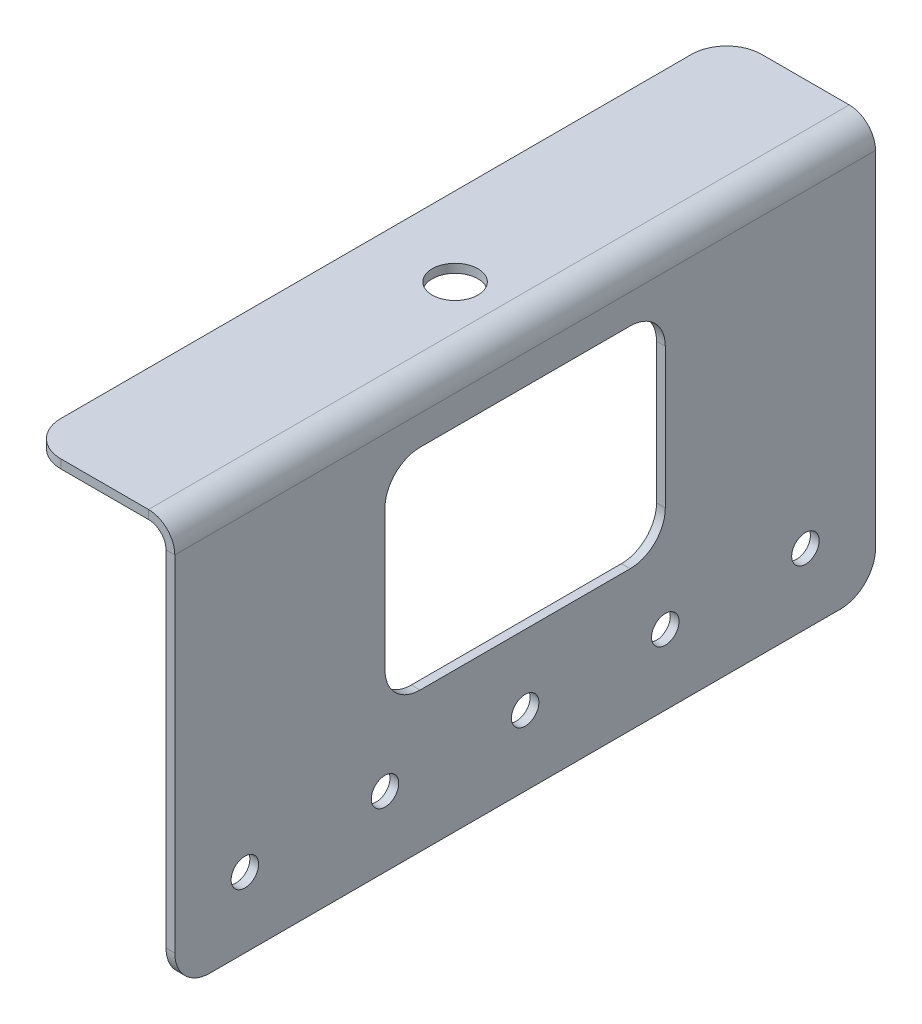
ISO-10303-21;
HEADER;
FILE_DESCRIPTION(('STEP AP214'),'2;1');
FILE_NAME('part.step','',(''),(''),'','','');
FILE_SCHEMA(('AUTOMOTIVE_DESIGN { 1 0 10303 214 1 1 1 1 }'));
ENDSEC;
DATA;
#1=APPLICATION_CONTEXT('core data for automotive mechanical design processes');
#2=APPLICATION_PROTOCOL_DEFINITION('international standard','automotive_design',2000,#1);
#3=PRODUCT_CONTEXT('',#1,'mechanical');
#4=PRODUCT('Part','Part','',(#3));
#5=PRODUCT_RELATED_PRODUCT_CATEGORY('part','',(#4));
#6=PRODUCT_DEFINITION_FORMATION('','',#4);
#7=PRODUCT_DEFINITION_CONTEXT('part definition',#1,'design');
#8=PRODUCT_DEFINITION('design','',#6,#7);
#9=PRODUCT_DEFINITION_SHAPE('','',#8);
#10=(LENGTH_UNIT() NAMED_UNIT(*) SI_UNIT(.MILLI.,.METRE.));
#11=(NAMED_UNIT(*) PLANE_ANGLE_UNIT() SI_UNIT($,.RADIAN.));
#12=(NAMED_UNIT(*) SI_UNIT($,.STERADIAN.) SOLID_ANGLE_UNIT());
#13=UNCERTAINTY_MEASURE_WITH_UNIT(LENGTH_MEASURE(1.E-05),#10,'distance_accuracy_value','');
#14=(GEOMETRIC_REPRESENTATION_CONTEXT(3) GLOBAL_UNCERTAINTY_ASSIGNED_CONTEXT((#13)) GLOBAL_UNIT_ASSIGNED_CONTEXT((#10,
#11,#12)) REPRESENTATION_CONTEXT('',''));
#15=CARTESIAN_POINT('',(0.,0.,0.));
#16=DIRECTION('',(0.,0.,1.));
#17=DIRECTION('',(1.,0.,0.));
#18=AXIS2_PLACEMENT_3D('',#15,#16,#17);
#19=CARTESIAN_POINT('',(39.6875,576.261738,-38.1));
#20=DIRECTION('',(0.,1.,0.));
#21=DIRECTION('',(0.,0.,1.));
#22=AXIS2_PLACEMENT_3D('',#19,#20,#21);
#23=PLANE('',#22);
#24=DIRECTION('',(1.,0.,0.));
#25=VECTOR('',#24,1.);
#26=CARTESIAN_POINT('',(39.6875,576.261738,-44.45));
#27=LINE('',#26,#25);
#28=CARTESIAN_POINT('',(38.1000000000001,576.261738,-44.45));
#29=VERTEX_POINT('',#28);
#30=CARTESIAN_POINT('',(39.6875,576.261738,-44.45));
#31=VERTEX_POINT('',#30);
#32=EDGE_CURVE('E11',#29,#31,#27,.T.);
#33=ORIENTED_EDGE('',*,*,#32,.F.);
#34=DIRECTION('',(0.,0.,1.));
#35=VECTOR('',#34,1.);
#36=CARTESIAN_POINT('',(38.1000000000001,576.261738,-127.));
#37=LINE('',#36,#35);
#38=CARTESIAN_POINT('',(38.1000000000001,576.261738,-82.55));
#39=VERTEX_POINT('',#38);
#40=EDGE_CURVE('E149',#39,#29,#37,.T.);
#41=ORIENTED_EDGE('',*,*,#40,.F.);
#42=DIRECTION('',(1.,0.,0.));
#43=VECTOR('',#42,1.);
#44=CARTESIAN_POINT('',(39.6875,576.261738,-82.55));
#45=LINE('',#44,#43);
#46=CARTESIAN_POINT('',(39.6875,576.261738,-82.55));
#47=VERTEX_POINT('',#46);
#48=EDGE_CURVE('E51',#39,#47,#45,.T.);
#49=ORIENTED_EDGE('',*,*,#48,.T.);
#50=DIRECTION('',(0.,0.,1.));
#51=VECTOR('',#50,1.);
#52=CARTESIAN_POINT('',(39.6875,576.261738,-38.1));
#53=LINE('',#52,#51);
#54=EDGE_CURVE('E229',#47,#31,#53,.T.);
#55=ORIENTED_EDGE('',*,*,#54,.T.);
#56=EDGE_LOOP('',(#33,#41,#49,#55));
#57=FACE_BOUND('',#56,.T.);
#58=ADVANCED_FACE('F41',(#57),#23,.F.);
#59=CARTESIAN_POINT('',(39.6875000000001,569.911738,-82.55));
#60=DIRECTION('',(1.,0.,0.));
#61=DIRECTION('',(0.,1.,0.));
#62=AXIS2_PLACEMENT_3D('',#59,#60,#61);
#63=CYLINDRICAL_SURFACE('',#62,6.35);
#64=ORIENTED_EDGE('',*,*,#48,.F.);
#65=CARTESIAN_POINT('',(38.1000000000001,569.911738,-82.55));
#66=DIRECTION('',(1.,0.,0.));
#67=DIRECTION('',(0.,1.,0.));
#68=AXIS2_PLACEMENT_3D('',#65,#66,#67);
#69=CIRCLE('',#68,6.35);
#70=CARTESIAN_POINT('',(38.1000000000001,569.911738,-88.9));
#71=VERTEX_POINT('',#70);
#72=EDGE_CURVE('E172',#39,#71,#69,.F.);
#73=ORIENTED_EDGE('',*,*,#72,.T.);
#74=DIRECTION('',(1.,0.,0.));
#75=VECTOR('',#74,1.);
#76=CARTESIAN_POINT('',(39.6875,569.911738,-88.9));
#77=LINE('',#76,#75);
#78=CARTESIAN_POINT('',(39.6875,569.911738,-88.9));
#79=VERTEX_POINT('',#78);
#80=EDGE_CURVE('E222',#71,#79,#77,.T.);
#81=ORIENTED_EDGE('',*,*,#80,.T.);
#82=CARTESIAN_POINT('',(39.6875000000001,569.911738,-82.55));
#83=DIRECTION('',(1.,0.,0.));
#84=DIRECTION('',(0.,1.,0.));
#85=AXIS2_PLACEMENT_3D('',#82,#83,#84);
#86=CIRCLE('',#85,6.35);
#87=EDGE_CURVE('E239',#47,#79,#86,.F.);
#88=ORIENTED_EDGE('',*,*,#87,.F.);
#89=EDGE_LOOP('',(#64,#73,#81,#88));
#90=FACE_BOUND('',#89,.T.);
#91=ADVANCED_FACE('F242',(#90),#63,.F.);
#92=CARTESIAN_POINT('',(39.6875,576.261738,-88.9));
#93=DIRECTION('',(0.,0.,-1.));
#94=DIRECTION('',(0.,1.,0.));
#95=AXIS2_PLACEMENT_3D('',#92,#93,#94);
#96=PLANE('',#95);
#97=ORIENTED_EDGE('',*,*,#80,.F.);
#98=DIRECTION('',(0.,1.,0.));
#99=VECTOR('',#98,1.);
#100=CARTESIAN_POINT('',(38.1000000000001,581.589048146248,-88.9));
#101=LINE('',#100,#99);
#102=CARTESIAN_POINT('',(38.1000000000001,544.511738,-88.9));
#103=VERTEX_POINT('',#102);
#104=EDGE_CURVE('E169',#103,#71,#101,.T.);
#105=ORIENTED_EDGE('',*,*,#104,.F.);
#106=DIRECTION('',(1.,0.,0.));
#107=VECTOR('',#106,1.);
#108=CARTESIAN_POINT('',(39.6875,544.511738,-88.9));
#109=LINE('',#108,#107);
#110=CARTESIAN_POINT('',(39.6875,544.511738,-88.9));
#111=VERTEX_POINT('',#110);
#112=EDGE_CURVE('E219',#103,#111,#109,.T.);
#113=ORIENTED_EDGE('',*,*,#112,.T.);
#114=DIRECTION('',(0.,1.,0.));
#115=VECTOR('',#114,1.);
#116=CARTESIAN_POINT('',(39.6875,576.261738,-88.9));
#117=LINE('',#116,#115);
#118=EDGE_CURVE('E243',#111,#79,#117,.T.);
#119=ORIENTED_EDGE('',*,*,#118,.T.);
#120=EDGE_LOOP('',(#97,#105,#113,#119));
#121=FACE_BOUND('',#120,.T.);
#122=ADVANCED_FACE('F380',(#121),#96,.F.);
#123=CARTESIAN_POINT('',(39.6875000000001,544.511738,-82.55));
#124=DIRECTION('',(1.,0.,0.));
#125=DIRECTION('',(0.,1.,0.));
#126=AXIS2_PLACEMENT_3D('',#123,#124,#125);
#127=CYLINDRICAL_SURFACE('',#126,6.35);
#128=ORIENTED_EDGE('',*,*,#112,.F.);
#129=CARTESIAN_POINT('',(38.1000000000001,544.511738,-82.55));
#130=DIRECTION('',(1.,0.,0.));
#131=DIRECTION('',(0.,1.,0.));
#132=AXIS2_PLACEMENT_3D('',#129,#130,#131);
#133=CIRCLE('',#132,6.35);
#134=CARTESIAN_POINT('',(38.1000000000001,538.161738,-82.55));
#135=VERTEX_POINT('',#134);
#136=EDGE_CURVE('E166',#103,#135,#133,.F.);
#137=ORIENTED_EDGE('',*,*,#136,.T.);
#138=DIRECTION('',(1.,0.,0.));
#139=VECTOR('',#138,1.);
#140=CARTESIAN_POINT('',(39.6875,538.161738,-82.55));
#141=LINE('',#140,#139);
#142=CARTESIAN_POINT('',(39.6875,538.161738,-82.55));
#143=VERTEX_POINT('',#142);
#144=EDGE_CURVE('E216',#135,#143,#141,.T.);
#145=ORIENTED_EDGE('',*,*,#144,.T.);
#146=CARTESIAN_POINT('',(39.6875000000001,544.511738,-82.55));
#147=DIRECTION('',(1.,0.,0.));
#148=DIRECTION('',(0.,1.,0.));
#149=AXIS2_PLACEMENT_3D('',#146,#147,#148);
#150=CIRCLE('',#149,6.35);
#151=EDGE_CURVE('E245',#111,#143,#150,.F.);
#152=ORIENTED_EDGE('',*,*,#151,.F.);
#153=EDGE_LOOP('',(#128,#137,#145,#152));
#154=FACE_BOUND('',#153,.T.);
#155=ADVANCED_FACE('F527',(#154),#127,.F.);
#156=CARTESIAN_POINT('',(39.6875,538.161738,-38.1));
#157=DIRECTION('',(0.,-1.,0.));
#158=DIRECTION('',(0.,0.,-1.));
#159=AXIS2_PLACEMENT_3D('',#156,#157,#158);
#160=PLANE('',#159);
#161=ORIENTED_EDGE('',*,*,#144,.F.);
#162=DIRECTION('',(0.,0.,1.));
#163=VECTOR('',#162,1.);
#164=CARTESIAN_POINT('',(38.1000000000001,538.161738,-127.));
#165=LINE('',#164,#163);
#166=CARTESIAN_POINT('',(38.1000000000001,538.161738,-44.45));
#167=VERTEX_POINT('',#166);
#168=EDGE_CURVE('E163',#167,#135,#165,.F.);
#169=ORIENTED_EDGE('',*,*,#168,.F.);
#170=DIRECTION('',(1.,0.,0.));
#171=VECTOR('',#170,1.);
#172=CARTESIAN_POINT('',(39.6875,538.161738,-44.45));
#173=LINE('',#172,#171);
#174=CARTESIAN_POINT('',(39.6875,538.161738,-44.45));
#175=VERTEX_POINT('',#174);
#176=EDGE_CURVE('E213',#167,#175,#173,.T.);
#177=ORIENTED_EDGE('',*,*,#176,.T.);
#178=DIRECTION('',(0.,0.,-1.));
#179=VECTOR('',#178,1.);
#180=CARTESIAN_POINT('',(39.6875,538.161738,-38.1));
#181=LINE('',#180,#179);
#182=EDGE_CURVE('E251',#175,#143,#181,.T.);
#183=ORIENTED_EDGE('',*,*,#182,.T.);
#184=EDGE_LOOP('',(#161,#169,#177,#183));
#185=FACE_BOUND('',#184,.T.);
#186=ADVANCED_FACE('F528',(#185),#160,.F.);
#187=CARTESIAN_POINT('',(39.6875000000001,544.511738,-44.45));
#188=DIRECTION('',(1.,0.,0.));
#189=DIRECTION('',(0.,1.,0.));
#190=AXIS2_PLACEMENT_3D('',#187,#188,#189);
#191=CYLINDRICAL_SURFACE('',#190,6.35);
#192=ORIENTED_EDGE('',*,*,#176,.F.);
#193=CARTESIAN_POINT('',(38.1000000000001,544.511738,-44.45));
#194=DIRECTION('',(1.,0.,0.));
#195=DIRECTION('',(0.,1.,0.));
#196=AXIS2_PLACEMENT_3D('',#193,#194,#195);
#197=CIRCLE('',#196,6.35);
#198=CARTESIAN_POINT('',(38.1000000000001,544.511738,-38.1));
#199=VERTEX_POINT('',#198);
#200=EDGE_CURVE('E160',#167,#199,#197,.F.);
#201=ORIENTED_EDGE('',*,*,#200,.T.);
#202=DIRECTION('',(1.,0.,0.));
#203=VECTOR('',#202,1.);
#204=CARTESIAN_POINT('',(39.6875,544.511738,-38.1));
#205=LINE('',#204,#203);
#206=CARTESIAN_POINT('',(39.6875,544.511738,-38.1));
#207=VERTEX_POINT('',#206);
#208=EDGE_CURVE('E139',#199,#207,#205,.T.);
#209=ORIENTED_EDGE('',*,*,#208,.T.);
#210=CARTESIAN_POINT('',(39.6875000000001,544.511738,-44.45));
#211=DIRECTION('',(1.,0.,0.));
#212=DIRECTION('',(0.,1.,0.));
#213=AXIS2_PLACEMENT_3D('',#210,#211,#212);
#214=CIRCLE('',#213,6.35);
#215=EDGE_CURVE('E254',#175,#207,#214,.F.);
#216=ORIENTED_EDGE('',*,*,#215,.F.);
#217=EDGE_LOOP('',(#192,#201,#209,#216));
#218=FACE_BOUND('',#217,.T.);
#219=ADVANCED_FACE('F511',(#218),#191,.F.);
#220=CARTESIAN_POINT('',(39.6875,576.261738,-38.1));
#221=DIRECTION('',(0.,0.,1.));
#222=DIRECTION('',(0.,-1.,0.));
#223=AXIS2_PLACEMENT_3D('',#220,#221,#222);
#224=PLANE('',#223);
#225=ORIENTED_EDGE('',*,*,#208,.F.);
#226=DIRECTION('',(0.,1.,0.));
#227=VECTOR('',#226,1.);
#228=CARTESIAN_POINT('',(38.1000000000001,581.589048146248,-38.1));
#229=LINE('',#228,#227);
#230=CARTESIAN_POINT('',(38.1000000000001,569.911738,-38.1));
#231=VERTEX_POINT('',#230);
#232=EDGE_CURVE('E146',#231,#199,#229,.F.);
#233=ORIENTED_EDGE('',*,*,#232,.F.);
#234=DIRECTION('',(1.,0.,0.));
#235=VECTOR('',#234,1.);
#236=CARTESIAN_POINT('',(39.6875,569.911738,-38.1));
#237=LINE('',#236,#235);
#238=CARTESIAN_POINT('',(39.6875,569.911738,-38.1));
#239=VERTEX_POINT('',#238);
#240=EDGE_CURVE('E45',#231,#239,#237,.T.);
#241=ORIENTED_EDGE('',*,*,#240,.T.);
#242=DIRECTION('',(0.,-1.,0.));
#243=VECTOR('',#242,1.);
#244=CARTESIAN_POINT('',(39.6875,576.261738,-38.1));
#245=LINE('',#244,#243);
#246=EDGE_CURVE('E505',#239,#207,#245,.T.);
#247=ORIENTED_EDGE('',*,*,#246,.T.);
#248=EDGE_LOOP('',(#225,#233,#241,#247));
#249=FACE_BOUND('',#248,.T.);
#250=ADVANCED_FACE('F151',(#249),#224,.F.);
#251=CARTESIAN_POINT('',(39.6875,519.111738,-6.35));
#252=DIRECTION('',(1.,0.,0.));
#253=DIRECTION('',(0.,1.,0.));
#254=AXIS2_PLACEMENT_3D('',#251,#252,#253);
#255=CYLINDRICAL_SURFACE('',#254,6.35);
#256=DIRECTION('',(1.,0.,0.));
#257=VECTOR('',#256,1.);
#258=CARTESIAN_POINT('',(39.6875,519.111738,0.));
#259=LINE('',#258,#257);
#260=CARTESIAN_POINT('',(38.1000000000001,519.111738,0.));
#261=VERTEX_POINT('',#260);
#262=CARTESIAN_POINT('',(39.6875,519.111738,0.));
#263=VERTEX_POINT('',#262);
#264=EDGE_CURVE('E140',#261,#263,#259,.T.);
#265=ORIENTED_EDGE('',*,*,#264,.F.);
#266=CARTESIAN_POINT('',(38.1000000000001,519.111738,-6.35));
#267=DIRECTION('',(1.,0.,0.));
#268=DIRECTION('',(0.,1.,0.));
#269=AXIS2_PLACEMENT_3D('',#266,#267,#268);
#270=CIRCLE('',#269,6.35);
#271=CARTESIAN_POINT('',(38.1,512.761738,-6.34999999999999));
#272=VERTEX_POINT('',#271);
#273=EDGE_CURVE('E341',#261,#272,#270,.T.);
#274=ORIENTED_EDGE('',*,*,#273,.T.);
#275=DIRECTION('',(1.,0.,0.));
#276=VECTOR('',#275,1.);
#277=CARTESIAN_POINT('',(39.6875,512.761738,-6.34999999999999));
#278=LINE('',#277,#276);
#279=CARTESIAN_POINT('',(39.6875,512.761738,-6.34999999999999));
#280=VERTEX_POINT('',#279);
#281=EDGE_CURVE('E204',#272,#280,#278,.T.);
#282=ORIENTED_EDGE('',*,*,#281,.T.);
#283=CARTESIAN_POINT('',(39.6875,519.111738,-6.35));
#284=DIRECTION('',(1.,0.,0.));
#285=DIRECTION('',(0.,1.,0.));
#286=AXIS2_PLACEMENT_3D('',#283,#284,#285);
#287=CIRCLE('',#286,6.35);
#288=EDGE_CURVE('E275',#263,#280,#287,.T.);
#289=ORIENTED_EDGE('',*,*,#288,.F.);
#290=EDGE_LOOP('',(#265,#274,#282,#289));
#291=FACE_BOUND('',#290,.T.);
#292=ADVANCED_FACE('F410',(#291),#255,.T.);
#293=CARTESIAN_POINT('',(39.6875,512.761738,-127.));
#294=DIRECTION('',(0.,1.,0.));
#295=DIRECTION('',(0.,0.,1.));
#296=AXIS2_PLACEMENT_3D('',#293,#294,#295);
#297=PLANE('',#296);
#298=ORIENTED_EDGE('',*,*,#281,.F.);
#299=DIRECTION('',(0.,0.,1.));
#300=VECTOR('',#299,1.);
#301=CARTESIAN_POINT('',(38.1,512.761738,-127.));
#302=LINE('',#301,#300);
#303=CARTESIAN_POINT('',(38.1,512.761738,-120.65));
#304=VERTEX_POINT('',#303);
#305=EDGE_CURVE('E178',#304,#272,#302,.T.);
#306=ORIENTED_EDGE('',*,*,#305,.F.);
#307=DIRECTION('',(1.,0.,0.));
#308=VECTOR('',#307,1.);
#309=CARTESIAN_POINT('',(39.6875,512.761738,-120.65));
#310=LINE('',#309,#308);
#311=CARTESIAN_POINT('',(39.6875,512.761738,-120.65));
#312=VERTEX_POINT('',#311);
#313=EDGE_CURVE('E201',#304,#312,#310,.T.);
#314=ORIENTED_EDGE('',*,*,#313,.T.);
#315=DIRECTION('',(0.,0.,1.));
#316=VECTOR('',#315,1.);
#317=CARTESIAN_POINT('',(39.6875,512.761738,-127.));
#318=LINE('',#317,#316);
#319=EDGE_CURVE('E260',#312,#280,#318,.T.);
#320=ORIENTED_EDGE('',*,*,#319,.T.);
#321=EDGE_LOOP('',(#298,#306,#314,#320));
#322=FACE_BOUND('',#321,.T.);
#323=ADVANCED_FACE('F468',(#322),#297,.F.);
#324=CARTESIAN_POINT('',(39.6875,519.111738,-120.65));
#325=DIRECTION('',(1.,0.,0.));
#326=DIRECTION('',(0.,1.,0.));
#327=AXIS2_PLACEMENT_3D('',#324,#325,#326);
#328=CYLINDRICAL_SURFACE('',#327,6.35);
#329=ORIENTED_EDGE('',*,*,#313,.F.);
#330=CARTESIAN_POINT('',(38.1000000000001,519.111738,-120.65));
#331=DIRECTION('',(1.,0.,0.));
#332=DIRECTION('',(0.,1.,0.));
#333=AXIS2_PLACEMENT_3D('',#330,#331,#332);
#334=CIRCLE('',#333,6.35);
#335=CARTESIAN_POINT('',(38.1000000000001,519.111738,-127.));
#336=VERTEX_POINT('',#335);
#337=EDGE_CURVE('E336',#304,#336,#334,.T.);
#338=ORIENTED_EDGE('',*,*,#337,.T.);
#339=DIRECTION('',(1.,0.,0.));
#340=VECTOR('',#339,1.);
#341=CARTESIAN_POINT('',(39.6875,519.111738,-127.));
#342=LINE('',#341,#340);
#343=CARTESIAN_POINT('',(39.6875,519.111738,-127.));
#344=VERTEX_POINT('',#343);
#345=EDGE_CURVE('E198',#336,#344,#342,.T.);
#346=ORIENTED_EDGE('',*,*,#345,.T.);
#347=CARTESIAN_POINT('',(39.6875,519.111738,-120.65));
#348=DIRECTION('',(1.,0.,0.));
#349=DIRECTION('',(0.,1.,0.));
#350=AXIS2_PLACEMENT_3D('',#347,#348,#349);
#351=CIRCLE('',#350,6.35);
#352=EDGE_CURVE('E263',#312,#344,#351,.T.);
#353=ORIENTED_EDGE('',*,*,#352,.F.);
#354=EDGE_LOOP('',(#329,#338,#346,#353));
#355=FACE_BOUND('',#354,.T.);
#356=ADVANCED_FACE('F466',(#355),#328,.T.);
#357=CARTESIAN_POINT('',(39.6875000000001,581.589048146248,-127.));
#358=DIRECTION('',(0.,0.,-1.));
#359=DIRECTION('',(0.,1.,0.));
#360=AXIS2_PLACEMENT_3D('',#357,#358,#359);
#361=PLANE('',#360);
#362=ORIENTED_EDGE('',*,*,#345,.F.);
#363=DIRECTION('',(0.,1.,0.));
#364=VECTOR('',#363,1.);
#365=CARTESIAN_POINT('',(38.1000000000001,581.589048146248,-127.));
#366=LINE('',#365,#364);
#367=CARTESIAN_POINT('',(38.1000000000001,581.589048146248,-127.));
#368=VERTEX_POINT('',#367);
#369=EDGE_CURVE('E308',#336,#368,#366,.T.);
#370=ORIENTED_EDGE('',*,*,#369,.T.);
#371=DIRECTION('',(1.,0.,0.));
#372=VECTOR('',#371,1.);
#373=CARTESIAN_POINT('',(39.6875000000001,581.589048146248,-127.));
#374=LINE('',#373,#372);
#375=CARTESIAN_POINT('',(39.6875000000001,581.589048146248,-127.));
#376=VERTEX_POINT('',#375);
#377=EDGE_CURVE('E195',#368,#376,#374,.T.);
#378=ORIENTED_EDGE('',*,*,#377,.T.);
#379=DIRECTION('',(0.,1.,0.));
#380=VECTOR('',#379,1.);
#381=CARTESIAN_POINT('',(39.6875000000001,581.589048146248,-127.));
#382=LINE('',#381,#380);
#383=EDGE_CURVE('E266',#344,#376,#382,.T.);
#384=ORIENTED_EDGE('',*,*,#383,.F.);
#385=EDGE_LOOP('',(#362,#370,#378,#384));
#386=FACE_BOUND('',#385,.T.);
#387=ADVANCED_FACE('F463',(#386),#361,.T.);
#388=CARTESIAN_POINT('',(34.925,581.589048146248,-127.));
#389=DIRECTION('',(0.,0.,-1.));
#390=DIRECTION('',(-1.,0.,0.));
#391=AXIS2_PLACEMENT_3D('',#388,#389,#390);
#392=PLANE('',#391);
#393=ORIENTED_EDGE('',*,*,#377,.F.);
#394=CARTESIAN_POINT('',(34.925,581.589048146248,-127.));
#395=DIRECTION('',(0.,0.,1.));
#396=DIRECTION('',(1.,0.,0.));
#397=AXIS2_PLACEMENT_3D('',#394,#395,#396);
#398=CIRCLE('',#397,3.17500000000003);
#399=CARTESIAN_POINT('',(34.925,584.764048146248,-127.));
#400=VERTEX_POINT('',#399);
#401=EDGE_CURVE('E316',#368,#400,#398,.T.);
#402=ORIENTED_EDGE('',*,*,#401,.T.);
#403=DIRECTION('',(0.,1.,0.));
#404=VECTOR('',#403,1.);
#405=CARTESIAN_POINT('',(34.925,586.351548146248,-127.));
#406=LINE('',#405,#404);
#407=CARTESIAN_POINT('',(34.925,586.351548146248,-127.));
#408=VERTEX_POINT('',#407);
#409=EDGE_CURVE('E59',#400,#408,#406,.T.);
#410=ORIENTED_EDGE('',*,*,#409,.T.);
#411=CARTESIAN_POINT('',(34.925,581.589048146248,-127.));
#412=DIRECTION('',(0.,0.,1.));
#413=DIRECTION('',(1.,0.,0.));
#414=AXIS2_PLACEMENT_3D('',#411,#412,#413);
#415=CIRCLE('',#414,4.76250000000003);
#416=EDGE_CURVE('E211',#376,#408,#415,.T.);
#417=ORIENTED_EDGE('',*,*,#416,.F.);
#418=EDGE_LOOP('',(#393,#402,#410,#417));
#419=FACE_BOUND('',#418,.T.);
#420=ADVANCED_FACE('F607',(#419),#392,.T.);
#421=CARTESIAN_POINT('',(12.7,586.351548146248,-127.));
#422=DIRECTION('',(0.,0.,-1.));
#423=DIRECTION('',(-1.,0.,0.));
#424=AXIS2_PLACEMENT_3D('',#421,#422,#423);
#425=PLANE('',#424);
#426=ORIENTED_EDGE('',*,*,#409,.F.);
#427=DIRECTION('',(1.,0.,0.));
#428=VECTOR('',#427,1.);
#429=CARTESIAN_POINT('',(12.7,584.764048146248,-127.));
#430=LINE('',#429,#428);
#431=CARTESIAN_POINT('',(19.05,584.764048146248,-127.));
#432=VERTEX_POINT('',#431);
#433=EDGE_CURVE('E328',#400,#432,#430,.F.);
#434=ORIENTED_EDGE('',*,*,#433,.T.);
#435=DIRECTION('',(0.,1.,0.));
#436=VECTOR('',#435,1.);
#437=CARTESIAN_POINT('',(19.05,586.351548146248,-127.));
#438=LINE('',#437,#436);
#439=CARTESIAN_POINT('',(19.05,586.351548146248,-127.));
#440=VERTEX_POINT('',#439);
#441=EDGE_CURVE('E191',#432,#440,#438,.T.);
#442=ORIENTED_EDGE('',*,*,#441,.T.);
#443=DIRECTION('',(-1.,0.,0.));
#444=VECTOR('',#443,1.);
#445=CARTESIAN_POINT('',(12.7,586.351548146248,-127.));
#446=LINE('',#445,#444);
#447=EDGE_CURVE('E281',#408,#440,#446,.T.);
#448=ORIENTED_EDGE('',*,*,#447,.F.);
#449=EDGE_LOOP('',(#426,#434,#442,#448));
#450=FACE_BOUND('',#449,.T.);
#451=ADVANCED_FACE('F618',(#450),#425,.T.);
#452=CARTESIAN_POINT('',(19.05,586.351548146248,-120.65));
#453=DIRECTION('',(0.,1.,0.));
#454=DIRECTION('',(0.,0.,1.));
#455=AXIS2_PLACEMENT_3D('',#452,#453,#454);
#456=CYLINDRICAL_SURFACE('',#455,6.35);
#457=ORIENTED_EDGE('',*,*,#441,.F.);
#458=CARTESIAN_POINT('',(19.05,584.764048146248,-120.65));
#459=DIRECTION('',(0.,1.,0.));
#460=DIRECTION('',(0.,0.,1.));
#461=AXIS2_PLACEMENT_3D('',#458,#459,#460);
#462=CIRCLE('',#461,6.35);
#463=CARTESIAN_POINT('',(12.7,584.764048146248,-120.65));
#464=VERTEX_POINT('',#463);
#465=EDGE_CURVE('E325',#432,#464,#462,.T.);
#466=ORIENTED_EDGE('',*,*,#465,.T.);
#467=DIRECTION('',(0.,1.,0.));
#468=VECTOR('',#467,1.);
#469=CARTESIAN_POINT('',(12.7,586.351548146248,-120.65));
#470=LINE('',#469,#468);
#471=CARTESIAN_POINT('',(12.7,586.351548146248,-120.65));
#472=VERTEX_POINT('',#471);
#473=EDGE_CURVE('E188',#464,#472,#470,.T.);
#474=ORIENTED_EDGE('',*,*,#473,.T.);
#475=CARTESIAN_POINT('',(19.05,586.351548146248,-120.65));
#476=DIRECTION('',(0.,1.,0.));
#477=DIRECTION('',(0.,0.,1.));
#478=AXIS2_PLACEMENT_3D('',#475,#476,#477);
#479=CIRCLE('',#478,6.35);
#480=EDGE_CURVE('E284',#440,#472,#479,.T.);
#481=ORIENTED_EDGE('',*,*,#480,.F.);
#482=EDGE_LOOP('',(#457,#466,#474,#481));
#483=FACE_BOUND('',#482,.T.);
#484=ADVANCED_FACE('F629',(#483),#456,.T.);
#485=CARTESIAN_POINT('',(12.7,586.351548146248,-127.));
#486=DIRECTION('',(-1.,0.,0.));
#487=DIRECTION('',(0.,0.,1.));
#488=AXIS2_PLACEMENT_3D('',#485,#486,#487);
#489=PLANE('',#488);
#490=ORIENTED_EDGE('',*,*,#473,.F.);
#491=DIRECTION('',(0.,0.,1.));
#492=VECTOR('',#491,1.);
#493=CARTESIAN_POINT('',(12.7,584.764048146248,-127.));
#494=LINE('',#493,#492);
#495=CARTESIAN_POINT('',(12.7,584.764048146248,-6.34999999999999));
#496=VERTEX_POINT('',#495);
#497=EDGE_CURVE('E322',#464,#496,#494,.T.);
#498=ORIENTED_EDGE('',*,*,#497,.T.);
#499=DIRECTION('',(0.,1.,0.));
#500=VECTOR('',#499,1.);
#501=CARTESIAN_POINT('',(12.7,586.351548146248,-6.34999999999999));
#502=LINE('',#501,#500);
#503=CARTESIAN_POINT('',(12.7,586.351548146248,-6.34999999999999));
#504=VERTEX_POINT('',#503);
#505=EDGE_CURVE('E185',#496,#504,#502,.T.);
#506=ORIENTED_EDGE('',*,*,#505,.T.);
#507=DIRECTION('',(0.,0.,1.));
#508=VECTOR('',#507,1.);
#509=CARTESIAN_POINT('',(12.7,586.351548146248,-127.));
#510=LINE('',#509,#508);
#511=EDGE_CURVE('E287',#472,#504,#510,.T.);
#512=ORIENTED_EDGE('',*,*,#511,.F.);
#513=EDGE_LOOP('',(#490,#498,#506,#512));
#514=FACE_BOUND('',#513,.T.);
#515=ADVANCED_FACE('F641',(#514),#489,.T.);
#516=CARTESIAN_POINT('',(19.05,586.351548146248,-6.35));
#517=DIRECTION('',(0.,1.,0.));
#518=DIRECTION('',(0.,0.,1.));
#519=AXIS2_PLACEMENT_3D('',#516,#517,#518);
#520=CYLINDRICAL_SURFACE('',#519,6.35);
#521=ORIENTED_EDGE('',*,*,#505,.F.);
#522=CARTESIAN_POINT('',(19.05,584.764048146248,-6.35));
#523=DIRECTION('',(0.,1.,0.));
#524=DIRECTION('',(0.,0.,1.));
#525=AXIS2_PLACEMENT_3D('',#522,#523,#524);
#526=CIRCLE('',#525,6.35);
#527=CARTESIAN_POINT('',(19.05,584.764048146248,0.));
#528=VERTEX_POINT('',#527);
#529=EDGE_CURVE('E319',#496,#528,#526,.T.);
#530=ORIENTED_EDGE('',*,*,#529,.T.);
#531=DIRECTION('',(0.,1.,0.));
#532=VECTOR('',#531,1.);
#533=CARTESIAN_POINT('',(19.05,586.351548146248,0.));
#534=LINE('',#533,#532);
#535=CARTESIAN_POINT('',(19.05,586.351548146248,0.));
#536=VERTEX_POINT('',#535);
#537=EDGE_CURVE('E181',#528,#536,#534,.T.);
#538=ORIENTED_EDGE('',*,*,#537,.T.);
#539=CARTESIAN_POINT('',(19.05,586.351548146248,-6.35));
#540=DIRECTION('',(0.,1.,0.));
#541=DIRECTION('',(0.,0.,1.));
#542=AXIS2_PLACEMENT_3D('',#539,#540,#541);
#543=CIRCLE('',#542,6.35);
#544=EDGE_CURVE('E290',#504,#536,#543,.T.);
#545=ORIENTED_EDGE('',*,*,#544,.F.);
#546=EDGE_LOOP('',(#521,#530,#538,#545));
#547=FACE_BOUND('',#546,.T.);
#548=ADVANCED_FACE('F443',(#547),#520,.T.);
#549=CARTESIAN_POINT('',(12.7,586.351548146248,0.));
#550=DIRECTION('',(0.,0.,-1.));
#551=DIRECTION('',(-1.,0.,0.));
#552=AXIS2_PLACEMENT_3D('',#549,#550,#551);
#553=PLANE('',#552);
#554=ORIENTED_EDGE('',*,*,#537,.F.);
#555=DIRECTION('',(1.,0.,0.));
#556=VECTOR('',#555,1.);
#557=CARTESIAN_POINT('',(12.7,584.764048146248,0.));
#558=LINE('',#557,#556);
#559=CARTESIAN_POINT('',(34.925,584.764048146248,0.));
#560=VERTEX_POINT('',#559);
#561=EDGE_CURVE('E313',#560,#528,#558,.F.);
#562=ORIENTED_EDGE('',*,*,#561,.F.);
#563=DIRECTION('',(0.,1.,0.));
#564=VECTOR('',#563,1.);
#565=CARTESIAN_POINT('',(34.925,586.351548146248,0.));
#566=LINE('',#565,#564);
#567=CARTESIAN_POINT('',(34.925,586.351548146248,0.));
#568=VERTEX_POINT('',#567);
#569=EDGE_CURVE('E179',#560,#568,#566,.T.);
#570=ORIENTED_EDGE('',*,*,#569,.T.);
#571=DIRECTION('',(-1.,0.,0.));
#572=VECTOR('',#571,1.);
#573=CARTESIAN_POINT('',(12.7,586.351548146248,0.));
#574=LINE('',#573,#572);
#575=EDGE_CURVE('E293',#568,#536,#574,.T.);
#576=ORIENTED_EDGE('',*,*,#575,.T.);
#577=EDGE_LOOP('',(#554,#562,#570,#576));
#578=FACE_BOUND('',#577,.T.);
#579=ADVANCED_FACE('F451',(#578),#553,.F.);
#580=CARTESIAN_POINT('',(34.925,581.589048146248,0.));
#581=DIRECTION('',(0.,0.,-1.));
#582=DIRECTION('',(-1.,0.,0.));
#583=AXIS2_PLACEMENT_3D('',#580,#581,#582);
#584=PLANE('',#583);
#585=ORIENTED_EDGE('',*,*,#569,.F.);
#586=CARTESIAN_POINT('',(34.925,581.589048146248,0.));
#587=DIRECTION('',(0.,0.,1.));
#588=DIRECTION('',(1.,0.,0.));
#589=AXIS2_PLACEMENT_3D('',#586,#587,#588);
#590=CIRCLE('',#589,3.17500000000003);
#591=CARTESIAN_POINT('',(38.1000000000001,581.589048146248,0.));
#592=VERTEX_POINT('',#591);
#593=EDGE_CURVE('E312',#592,#560,#590,.T.);
#594=ORIENTED_EDGE('',*,*,#593,.F.);
#595=DIRECTION('',(1.,0.,0.));
#596=VECTOR('',#595,1.);
#597=CARTESIAN_POINT('',(39.6875000000001,581.589048146248,0.));
#598=LINE('',#597,#596);
#599=CARTESIAN_POINT('',(39.6875000000001,581.589048146248,0.));
#600=VERTEX_POINT('',#599);
#601=EDGE_CURVE('E182',#592,#600,#598,.T.);
#602=ORIENTED_EDGE('',*,*,#601,.T.);
#603=CARTESIAN_POINT('',(34.925,581.589048146248,0.));
#604=DIRECTION('',(0.,0.,1.));
#605=DIRECTION('',(1.,0.,0.));
#606=AXIS2_PLACEMENT_3D('',#603,#604,#605);
#607=CIRCLE('',#606,4.76250000000003);
#608=EDGE_CURVE('E299',#600,#568,#607,.T.);
#609=ORIENTED_EDGE('',*,*,#608,.T.);
#610=EDGE_LOOP('',(#585,#594,#602,#609));
#611=FACE_BOUND('',#610,.T.);
#612=ADVANCED_FACE('F454',(#611),#584,.F.);
#613=CARTESIAN_POINT('',(39.6875,525.461738,-12.7));
#614=DIRECTION('',(1.,0.,0.));
#615=DIRECTION('',(0.,1.,0.));
#616=AXIS2_PLACEMENT_3D('',#613,#614,#615);
#617=CYLINDRICAL_SURFACE('',#616,2.48919999999996);
#618=CARTESIAN_POINT('',(39.6875,525.461738,-12.7));
#619=DIRECTION('',(1.,0.,0.));
#620=DIRECTION('',(0.,1.,0.));
#621=AXIS2_PLACEMENT_3D('',#618,#619,#620);
#622=CIRCLE('',#621,2.48919999999996);
#623=CARTESIAN_POINT('',(39.6875,527.950938,-12.7));
#624=VERTEX_POINT('',#623);
#625=EDGE_CURVE('E333',#624,#624,#622,.T.);
#626=ORIENTED_EDGE('',*,*,#625,.T.);
#627=EDGE_LOOP('',(#626));
#628=FACE_BOUND('',#627,.T.);
#629=CARTESIAN_POINT('',(38.1,525.461738,-12.7));
#630=DIRECTION('',(1.,0.,0.));
#631=DIRECTION('',(0.,1.,0.));
#632=AXIS2_PLACEMENT_3D('',#629,#630,#631);
#633=CIRCLE('',#632,2.48919999999996);
#634=CARTESIAN_POINT('',(38.1,527.950938,-12.7));
#635=VERTEX_POINT('',#634);
#636=EDGE_CURVE('E348',#635,#635,#633,.T.);
#637=ORIENTED_EDGE('',*,*,#636,.F.);
#638=EDGE_LOOP('',(#637));
#639=FACE_BOUND('',#638,.T.);
#640=ADVANCED_FACE('F370',(#628,#639),#617,.F.);
#641=CARTESIAN_POINT('',(39.6875,525.461738,-88.9));
#642=DIRECTION('',(1.,0.,0.));
#643=DIRECTION('',(0.,1.,0.));
#644=AXIS2_PLACEMENT_3D('',#641,#642,#643);
#645=CYLINDRICAL_SURFACE('',#644,2.48919999999996);
#646=CARTESIAN_POINT('',(39.6875,525.461738,-88.9));
#647=DIRECTION('',(1.,0.,0.));
#648=DIRECTION('',(0.,1.,0.));
#649=AXIS2_PLACEMENT_3D('',#646,#647,#648);
#650=CIRCLE('',#649,2.48919999999996);
#651=CARTESIAN_POINT('',(39.6875,527.950938,-88.9));
#652=VERTEX_POINT('',#651);
#653=EDGE_CURVE('E495',#652,#652,#650,.T.);
#654=ORIENTED_EDGE('',*,*,#653,.T.);
#655=EDGE_LOOP('',(#654));
#656=FACE_BOUND('',#655,.T.);
#657=CARTESIAN_POINT('',(38.1,525.461738,-88.9));
#658=DIRECTION('',(1.,0.,0.));
#659=DIRECTION('',(0.,1.,0.));
#660=AXIS2_PLACEMENT_3D('',#657,#658,#659);
#661=CIRCLE('',#660,2.48919999999996);
#662=CARTESIAN_POINT('',(38.1,527.950938,-88.9));
#663=VERTEX_POINT('',#662);
#664=EDGE_CURVE('E351',#663,#663,#661,.T.);
#665=ORIENTED_EDGE('',*,*,#664,.F.);
#666=EDGE_LOOP('',(#665));
#667=FACE_BOUND('',#666,.T.);
#668=ADVANCED_FACE('F361',(#656,#667),#645,.F.);
#669=CARTESIAN_POINT('',(39.6875,525.461738,-63.5));
#670=DIRECTION('',(1.,0.,0.));
#671=DIRECTION('',(0.,1.,0.));
#672=AXIS2_PLACEMENT_3D('',#669,#670,#671);
#673=CYLINDRICAL_SURFACE('',#672,2.48919999999996);
#674=CARTESIAN_POINT('',(39.6875,525.461738,-63.5));
#675=DIRECTION('',(1.,0.,0.));
#676=DIRECTION('',(0.,1.,0.));
#677=AXIS2_PLACEMENT_3D('',#674,#675,#676);
#678=CIRCLE('',#677,2.48919999999996);
#679=CARTESIAN_POINT('',(39.6875,527.950938,-63.5));
#680=VERTEX_POINT('',#679);
#681=EDGE_CURVE('E498',#680,#680,#678,.T.);
#682=ORIENTED_EDGE('',*,*,#681,.T.);
#683=EDGE_LOOP('',(#682));
#684=FACE_BOUND('',#683,.T.);
#685=CARTESIAN_POINT('',(38.1,525.461738,-63.5));
#686=DIRECTION('',(1.,0.,0.));
#687=DIRECTION('',(0.,1.,0.));
#688=AXIS2_PLACEMENT_3D('',#685,#686,#687);
#689=CIRCLE('',#688,2.48919999999996);
#690=CARTESIAN_POINT('',(38.1,527.950938,-63.5));
#691=VERTEX_POINT('',#690);
#692=EDGE_CURVE('E156',#691,#691,#689,.T.);
#693=ORIENTED_EDGE('',*,*,#692,.F.);
#694=EDGE_LOOP('',(#693));
#695=FACE_BOUND('',#694,.T.);
#696=ADVANCED_FACE('F358',(#684,#695),#673,.F.);
#697=CARTESIAN_POINT('',(39.6875,525.461738,-38.1));
#698=DIRECTION('',(1.,0.,0.));
#699=DIRECTION('',(0.,1.,0.));
#700=AXIS2_PLACEMENT_3D('',#697,#698,#699);
#701=CYLINDRICAL_SURFACE('',#700,2.48919999999996);
#702=CARTESIAN_POINT('',(39.6875,525.461738,-38.1));
#703=DIRECTION('',(1.,0.,0.));
#704=DIRECTION('',(0.,1.,0.));
#705=AXIS2_PLACEMENT_3D('',#702,#703,#704);
#706=CIRCLE('',#705,2.48919999999996);
#707=CARTESIAN_POINT('',(39.6875,527.950938,-38.1));
#708=VERTEX_POINT('',#707);
#709=EDGE_CURVE('E502',#708,#708,#706,.T.);
#710=ORIENTED_EDGE('',*,*,#709,.T.);
#711=EDGE_LOOP('',(#710));
#712=FACE_BOUND('',#711,.T.);
#713=CARTESIAN_POINT('',(38.1,525.461738,-38.1));
#714=DIRECTION('',(1.,0.,0.));
#715=DIRECTION('',(0.,1.,0.));
#716=AXIS2_PLACEMENT_3D('',#713,#714,#715);
#717=CIRCLE('',#716,2.48919999999996);
#718=CARTESIAN_POINT('',(38.1,527.950938,-38.1));
#719=VERTEX_POINT('',#718);
#720=EDGE_CURVE('E153',#719,#719,#717,.T.);
#721=ORIENTED_EDGE('',*,*,#720,.F.);
#722=EDGE_LOOP('',(#721));
#723=FACE_BOUND('',#722,.T.);
#724=ADVANCED_FACE('F360',(#712,#723),#701,.F.);
#725=CARTESIAN_POINT('',(39.6875000000001,569.911738,-44.45));
#726=DIRECTION('',(1.,0.,0.));
#727=DIRECTION('',(0.,1.,0.));
#728=AXIS2_PLACEMENT_3D('',#725,#726,#727);
#729=CYLINDRICAL_SURFACE('',#728,6.35);
#730=CARTESIAN_POINT('',(38.1000000000001,569.911738,-44.45));
#731=DIRECTION('',(1.,0.,0.));
#732=DIRECTION('',(0.,1.,0.));
#733=AXIS2_PLACEMENT_3D('',#730,#731,#732);
#734=CIRCLE('',#733,6.35);
#735=EDGE_CURVE('E132',#231,#29,#734,.F.);
#736=ORIENTED_EDGE('',*,*,#735,.T.);
#737=ORIENTED_EDGE('',*,*,#32,.T.);
#738=CARTESIAN_POINT('',(39.6875000000001,569.911738,-44.45));
#739=DIRECTION('',(1.,0.,0.));
#740=DIRECTION('',(0.,1.,0.));
#741=AXIS2_PLACEMENT_3D('',#738,#739,#740);
#742=CIRCLE('',#741,6.35);
#743=EDGE_CURVE('E134',#239,#31,#742,.F.);
#744=ORIENTED_EDGE('',*,*,#743,.F.);
#745=ORIENTED_EDGE('',*,*,#240,.F.);
#746=EDGE_LOOP('',(#736,#737,#744,#745));
#747=FACE_BOUND('',#746,.T.);
#748=ADVANCED_FACE('F131',(#747),#729,.F.);
#749=CARTESIAN_POINT('',(39.6875,525.461738,-114.3));
#750=DIRECTION('',(1.,0.,0.));
#751=DIRECTION('',(0.,1.,0.));
#752=AXIS2_PLACEMENT_3D('',#749,#750,#751);
#753=CYLINDRICAL_SURFACE('',#752,2.48919999999996);
#754=CARTESIAN_POINT('',(39.6875,525.461738,-114.3));
#755=DIRECTION('',(1.,0.,0.));
#756=DIRECTION('',(0.,1.,0.));
#757=AXIS2_PLACEMENT_3D('',#754,#755,#756);
#758=CIRCLE('',#757,2.48919999999996);
#759=CARTESIAN_POINT('',(39.6875,527.950938,-114.3));
#760=VERTEX_POINT('',#759);
#761=EDGE_CURVE('E257',#760,#760,#758,.T.);
#762=ORIENTED_EDGE('',*,*,#761,.T.);
#763=EDGE_LOOP('',(#762));
#764=FACE_BOUND('',#763,.T.);
#765=CARTESIAN_POINT('',(38.1,525.461738,-114.3));
#766=DIRECTION('',(1.,0.,0.));
#767=DIRECTION('',(0.,1.,0.));
#768=AXIS2_PLACEMENT_3D('',#765,#766,#767);
#769=CIRCLE('',#768,2.48919999999996);
#770=CARTESIAN_POINT('',(38.1,527.950938,-114.3));
#771=VERTEX_POINT('',#770);
#772=EDGE_CURVE('E162',#771,#771,#769,.T.);
#773=ORIENTED_EDGE('',*,*,#772,.F.);
#774=EDGE_LOOP('',(#773));
#775=FACE_BOUND('',#774,.T.);
#776=ADVANCED_FACE('F43',(#764,#775),#753,.F.);
#777=CARTESIAN_POINT('',(26.9875000000001,586.351548146248,-63.5));
#778=DIRECTION('',(0.,1.,0.));
#779=DIRECTION('',(0.,0.,1.));
#780=AXIS2_PLACEMENT_3D('',#777,#778,#779);
#781=CYLINDRICAL_SURFACE('',#780,4.14019999999999);
#782=CARTESIAN_POINT('',(26.9875000000001,586.351548146248,-63.5));
#783=DIRECTION('',(0.,1.,0.));
#784=DIRECTION('',(0.,0.,1.));
#785=AXIS2_PLACEMENT_3D('',#782,#783,#784);
#786=CIRCLE('',#785,4.14019999999999);
#787=CARTESIAN_POINT('',(26.9875000000001,586.351548146248,-59.3598));
#788=VERTEX_POINT('',#787);
#789=EDGE_CURVE('E278',#788,#788,#786,.T.);
#790=ORIENTED_EDGE('',*,*,#789,.T.);
#791=EDGE_LOOP('',(#790));
#792=FACE_BOUND('',#791,.T.);
#793=CARTESIAN_POINT('',(26.9875000000001,584.764048146248,-63.5));
#794=DIRECTION('',(0.,1.,0.));
#795=DIRECTION('',(0.,0.,1.));
#796=AXIS2_PLACEMENT_3D('',#793,#794,#795);
#797=CIRCLE('',#796,4.14019999999999);
#798=CARTESIAN_POINT('',(26.9875000000001,584.764048146248,-59.3598));
#799=VERTEX_POINT('',#798);
#800=EDGE_CURVE('E331',#799,#799,#797,.T.);
#801=ORIENTED_EDGE('',*,*,#800,.F.);
#802=EDGE_LOOP('',(#801));
#803=FACE_BOUND('',#802,.T.);
#804=ADVANCED_FACE('F387',(#792,#803),#781,.F.);
#805=CARTESIAN_POINT('',(39.6875000000001,581.589048146248,0.));
#806=DIRECTION('',(0.,0.,-1.));
#807=DIRECTION('',(0.,1.,0.));
#808=AXIS2_PLACEMENT_3D('',#805,#806,#807);
#809=PLANE('',#808);
#810=DIRECTION('',(0.,1.,0.));
#811=VECTOR('',#810,1.);
#812=CARTESIAN_POINT('',(38.1000000000001,581.589048146248,0.));
#813=LINE('',#812,#811);
#814=EDGE_CURVE('E307',#261,#592,#813,.T.);
#815=ORIENTED_EDGE('',*,*,#814,.F.);
#816=ORIENTED_EDGE('',*,*,#264,.T.);
#817=DIRECTION('',(0.,1.,0.));
#818=VECTOR('',#817,1.);
#819=CARTESIAN_POINT('',(39.6875000000001,581.589048146248,0.));
#820=LINE('',#819,#818);
#821=EDGE_CURVE('E272',#263,#600,#820,.T.);
#822=ORIENTED_EDGE('',*,*,#821,.T.);
#823=ORIENTED_EDGE('',*,*,#601,.F.);
#824=EDGE_LOOP('',(#815,#816,#822,#823));
#825=FACE_BOUND('',#824,.T.);
#826=ADVANCED_FACE('F392',(#825),#809,.F.);
#827=CARTESIAN_POINT('',(34.925,581.589048146248,-127.));
#828=DIRECTION('',(0.,0.,1.));
#829=DIRECTION('',(1.,0.,0.));
#830=AXIS2_PLACEMENT_3D('',#827,#828,#829);
#831=CYLINDRICAL_SURFACE('',#830,4.76250000000003);
#832=ORIENTED_EDGE('',*,*,#608,.F.);
#833=DIRECTION('',(0.,0.,1.));
#834=VECTOR('',#833,1.);
#835=CARTESIAN_POINT('',(39.6875000000001,581.589048146248,-127.));
#836=LINE('',#835,#834);
#837=EDGE_CURVE('E269',#376,#600,#836,.T.);
#838=ORIENTED_EDGE('',*,*,#837,.F.);
#839=ORIENTED_EDGE('',*,*,#416,.T.);
#840=DIRECTION('',(0.,0.,1.));
#841=VECTOR('',#840,1.);
#842=CARTESIAN_POINT('',(34.925,586.351548146248,-127.));
#843=LINE('',#842,#841);
#844=EDGE_CURVE('E296',#408,#568,#843,.T.);
#845=ORIENTED_EDGE('',*,*,#844,.T.);
#846=EDGE_LOOP('',(#832,#838,#839,#845));
#847=FACE_BOUND('',#846,.T.);
#848=ADVANCED_FACE('F426',(#847),#831,.T.);
#849=CARTESIAN_POINT('',(12.7,586.351548146248,-127.));
#850=DIRECTION('',(0.,1.,0.));
#851=DIRECTION('',(0.,0.,1.));
#852=AXIS2_PLACEMENT_3D('',#849,#850,#851);
#853=PLANE('',#852);
#854=ORIENTED_EDGE('',*,*,#789,.F.);
#855=EDGE_LOOP('',(#854));
#856=FACE_BOUND('',#855,.T.);
#857=ORIENTED_EDGE('',*,*,#447,.T.);
#858=ORIENTED_EDGE('',*,*,#480,.T.);
#859=ORIENTED_EDGE('',*,*,#511,.T.);
#860=ORIENTED_EDGE('',*,*,#544,.T.);
#861=ORIENTED_EDGE('',*,*,#575,.F.);
#862=ORIENTED_EDGE('',*,*,#844,.F.);
#863=EDGE_LOOP('',(#857,#858,#859,#860,#861,#862));
#864=FACE_BOUND('',#863,.T.);
#865=ADVANCED_FACE('F449',(#856,#864),#853,.T.);
#866=CARTESIAN_POINT('',(39.6875000000001,581.589048146248,-127.));
#867=DIRECTION('',(1.,0.,0.));
#868=DIRECTION('',(0.,1.,0.));
#869=AXIS2_PLACEMENT_3D('',#866,#867,#868);
#870=PLANE('',#869);
#871=ORIENTED_EDGE('',*,*,#625,.F.);
#872=EDGE_LOOP('',(#871));
#873=FACE_BOUND('',#872,.T.);
#874=ORIENTED_EDGE('',*,*,#653,.F.);
#875=EDGE_LOOP('',(#874));
#876=FACE_BOUND('',#875,.T.);
#877=ORIENTED_EDGE('',*,*,#681,.F.);
#878=EDGE_LOOP('',(#877));
#879=FACE_BOUND('',#878,.T.);
#880=ORIENTED_EDGE('',*,*,#709,.F.);
#881=EDGE_LOOP('',(#880));
#882=FACE_BOUND('',#881,.T.);
#883=ORIENTED_EDGE('',*,*,#246,.F.);
#884=ORIENTED_EDGE('',*,*,#743,.T.);
#885=ORIENTED_EDGE('',*,*,#54,.F.);
#886=ORIENTED_EDGE('',*,*,#87,.T.);
#887=ORIENTED_EDGE('',*,*,#118,.F.);
#888=ORIENTED_EDGE('',*,*,#151,.T.);
#889=ORIENTED_EDGE('',*,*,#182,.F.);
#890=ORIENTED_EDGE('',*,*,#215,.T.);
#891=EDGE_LOOP('',(#883,#884,#885,#886,#887,#888,#889,#890));
#892=FACE_BOUND('',#891,.T.);
#893=ORIENTED_EDGE('',*,*,#761,.F.);
#894=EDGE_LOOP('',(#893));
#895=FACE_BOUND('',#894,.T.);
#896=ORIENTED_EDGE('',*,*,#319,.F.);
#897=ORIENTED_EDGE('',*,*,#352,.T.);
#898=ORIENTED_EDGE('',*,*,#383,.T.);
#899=ORIENTED_EDGE('',*,*,#837,.T.);
#900=ORIENTED_EDGE('',*,*,#821,.F.);
#901=ORIENTED_EDGE('',*,*,#288,.T.);
#902=EDGE_LOOP('',(#896,#897,#898,#899,#900,#901));
#903=FACE_BOUND('',#902,.T.);
#904=ADVANCED_FACE('F236',(#873,#876,#879,#882,#892,#895,#903),#870,.T.);
#905=CARTESIAN_POINT('',(34.925,581.589048146248,-127.));
#906=DIRECTION('',(0.,0.,1.));
#907=DIRECTION('',(1.,0.,0.));
#908=AXIS2_PLACEMENT_3D('',#905,#906,#907);
#909=CYLINDRICAL_SURFACE('',#908,3.17500000000003);
#910=ORIENTED_EDGE('',*,*,#593,.T.);
#911=DIRECTION('',(0.,0.,1.));
#912=VECTOR('',#911,1.);
#913=CARTESIAN_POINT('',(34.925,584.764048146248,-127.));
#914=LINE('',#913,#912);
#915=EDGE_CURVE('E309',#400,#560,#914,.T.);
#916=ORIENTED_EDGE('',*,*,#915,.F.);
#917=ORIENTED_EDGE('',*,*,#401,.F.);
#918=DIRECTION('',(0.,0.,1.));
#919=VECTOR('',#918,1.);
#920=CARTESIAN_POINT('',(38.1000000000001,581.589048146248,-127.));
#921=LINE('',#920,#919);
#922=EDGE_CURVE('E304',#368,#592,#921,.T.);
#923=ORIENTED_EDGE('',*,*,#922,.T.);
#924=EDGE_LOOP('',(#910,#916,#917,#923));
#925=FACE_BOUND('',#924,.T.);
#926=ADVANCED_FACE('F461',(#925),#909,.F.);
#927=CARTESIAN_POINT('',(12.7,584.764048146248,-127.));
#928=DIRECTION('',(0.,1.,0.));
#929=DIRECTION('',(0.,0.,1.));
#930=AXIS2_PLACEMENT_3D('',#927,#928,#929);
#931=PLANE('',#930);
#932=ORIENTED_EDGE('',*,*,#800,.T.);
#933=EDGE_LOOP('',(#932));
#934=FACE_BOUND('',#933,.T.);
#935=ORIENTED_EDGE('',*,*,#433,.F.);
#936=ORIENTED_EDGE('',*,*,#915,.T.);
#937=ORIENTED_EDGE('',*,*,#561,.T.);
#938=ORIENTED_EDGE('',*,*,#529,.F.);
#939=ORIENTED_EDGE('',*,*,#497,.F.);
#940=ORIENTED_EDGE('',*,*,#465,.F.);
#941=EDGE_LOOP('',(#935,#936,#937,#938,#939,#940));
#942=FACE_BOUND('',#941,.T.);
#943=ADVANCED_FACE('F400',(#934,#942),#931,.F.);
#944=CARTESIAN_POINT('',(38.1000000000001,581.589048146248,-127.));
#945=DIRECTION('',(1.,0.,0.));
#946=DIRECTION('',(0.,1.,0.));
#947=AXIS2_PLACEMENT_3D('',#944,#945,#946);
#948=PLANE('',#947);
#949=ORIENTED_EDGE('',*,*,#636,.T.);
#950=EDGE_LOOP('',(#949));
#951=FACE_BOUND('',#950,.T.);
#952=ORIENTED_EDGE('',*,*,#664,.T.);
#953=EDGE_LOOP('',(#952));
#954=FACE_BOUND('',#953,.T.);
#955=ORIENTED_EDGE('',*,*,#692,.T.);
#956=EDGE_LOOP('',(#955));
#957=FACE_BOUND('',#956,.T.);
#958=ORIENTED_EDGE('',*,*,#720,.T.);
#959=EDGE_LOOP('',(#958));
#960=FACE_BOUND('',#959,.T.);
#961=ORIENTED_EDGE('',*,*,#232,.T.);
#962=ORIENTED_EDGE('',*,*,#200,.F.);
#963=ORIENTED_EDGE('',*,*,#168,.T.);
#964=ORIENTED_EDGE('',*,*,#136,.F.);
#965=ORIENTED_EDGE('',*,*,#104,.T.);
#966=ORIENTED_EDGE('',*,*,#72,.F.);
#967=ORIENTED_EDGE('',*,*,#40,.T.);
#968=ORIENTED_EDGE('',*,*,#735,.F.);
#969=EDGE_LOOP('',(#961,#962,#963,#964,#965,#966,#967,#968));
#970=FACE_BOUND('',#969,.T.);
#971=ORIENTED_EDGE('',*,*,#772,.T.);
#972=EDGE_LOOP('',(#971));
#973=FACE_BOUND('',#972,.T.);
#974=ORIENTED_EDGE('',*,*,#305,.T.);
#975=ORIENTED_EDGE('',*,*,#273,.F.);
#976=ORIENTED_EDGE('',*,*,#814,.T.);
#977=ORIENTED_EDGE('',*,*,#922,.F.);
#978=ORIENTED_EDGE('',*,*,#369,.F.);
#979=ORIENTED_EDGE('',*,*,#337,.F.);
#980=EDGE_LOOP('',(#974,#975,#976,#977,#978,#979));
#981=FACE_BOUND('',#980,.T.);
#982=ADVANCED_FACE('F143',(#951,#954,#957,#960,#970,#973,#981),#948,.F.);
#983=CLOSED_SHELL('',(#58,#91,#122,#155,#186,#219,#250,#292,#323,#356,#387,#420,#451,#484,#515,
#548,#579,#612,#640,#668,#696,#724,#748,#776,#804,#826,#848,#865,#904,#926,#943,#982));
#984=MANIFOLD_SOLID_BREP('B2',#983);
#985=ADVANCED_BREP_SHAPE_REPRESENTATION('',(#18,#984),#14);
#986=SHAPE_DEFINITION_REPRESENTATION(#9,#985);
ENDSEC;
END-ISO-10303-21;
